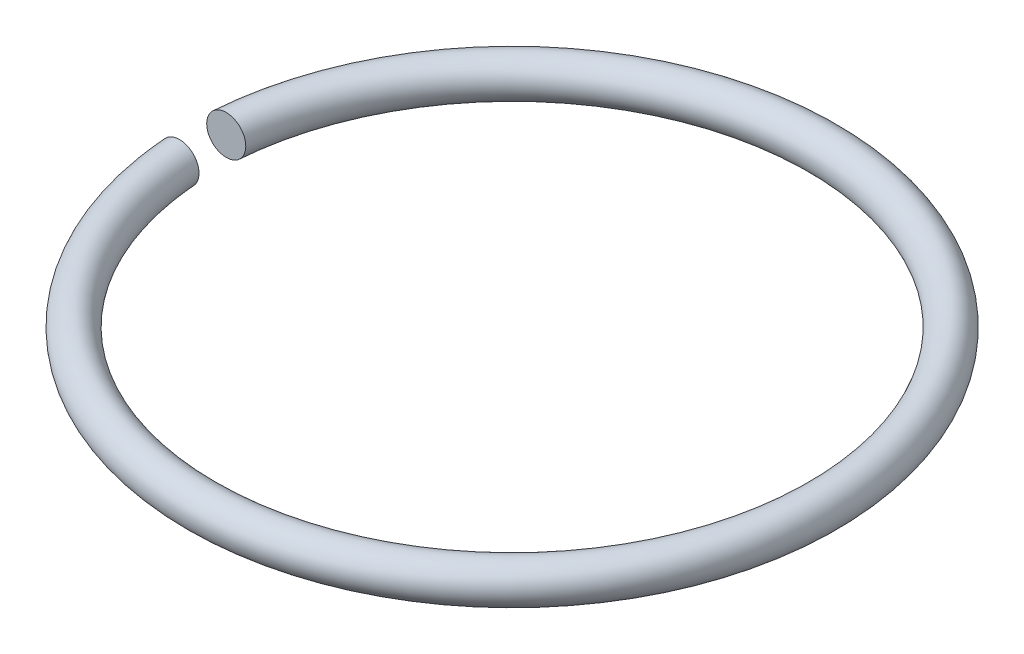
ISO-10303-21;
HEADER;
FILE_DESCRIPTION(('STEP AP214'),'2;1');
FILE_NAME('part.step','',(''),(''),'','','');
FILE_SCHEMA(('AUTOMOTIVE_DESIGN { 1 0 10303 214 1 1 1 1 }'));
ENDSEC;
DATA;
#1=APPLICATION_CONTEXT('core data for automotive mechanical design processes');
#2=APPLICATION_PROTOCOL_DEFINITION('international standard','automotive_design',2000,#1);
#3=PRODUCT_CONTEXT('',#1,'mechanical');
#4=PRODUCT('Part','Part','',(#3));
#5=PRODUCT_RELATED_PRODUCT_CATEGORY('part','',(#4));
#6=PRODUCT_DEFINITION_FORMATION('','',#4);
#7=PRODUCT_DEFINITION_CONTEXT('part definition',#1,'design');
#8=PRODUCT_DEFINITION('design','',#6,#7);
#9=PRODUCT_DEFINITION_SHAPE('','',#8);
#10=(LENGTH_UNIT() NAMED_UNIT(*) SI_UNIT(.MILLI.,.METRE.));
#11=(NAMED_UNIT(*) PLANE_ANGLE_UNIT() SI_UNIT($,.RADIAN.));
#12=(NAMED_UNIT(*) SI_UNIT($,.STERADIAN.) SOLID_ANGLE_UNIT());
#13=UNCERTAINTY_MEASURE_WITH_UNIT(LENGTH_MEASURE(1.E-05),#10,'distance_accuracy_value','');
#14=(GEOMETRIC_REPRESENTATION_CONTEXT(3) GLOBAL_UNCERTAINTY_ASSIGNED_CONTEXT((#13)) GLOBAL_UNIT_ASSIGNED_CONTEXT((#10,
#11,#12)) REPRESENTATION_CONTEXT('',''));
#15=CARTESIAN_POINT('',(0.,0.,0.));
#16=DIRECTION('',(0.,0.,1.));
#17=DIRECTION('',(1.,0.,0.));
#18=AXIS2_PLACEMENT_3D('',#15,#16,#17);
#19=CARTESIAN_POINT('',(0.,1.25,0.));
#20=DIRECTION('',(0.,-1.,0.));
#21=DIRECTION('',(0.,0.,-1.));
#22=AXIS2_PLACEMENT_3D('',#19,#20,#21);
#23=TOROIDAL_SURFACE('',#22,19.9,1.25);
#24=CARTESIAN_POINT('',(-20.9021824286294,0.581045337264175,1.5));
#25=CARTESIAN_POINT('',(-20.9397594164405,0.64021369669579,1.5));
#26=CARTESIAN_POINT('',(-20.9723730883378,0.702593877343459,1.5));
#27=CARTESIAN_POINT('',(-21.0266929579685,0.83199518138793,1.5));
#28=CARTESIAN_POINT('',(-21.0483862666287,0.899021683128394,1.5));
#29=CARTESIAN_POINT('',(-21.0801970165623,1.03574473228337,1.5));
#30=CARTESIAN_POINT('',(-21.0903193137983,1.10544014694468,1.5));
#31=CARTESIAN_POINT('',(-21.098705969198,1.24552217488984,1.5));
#32=CARTESIAN_POINT('',(-21.0969732316156,1.31590861466699,1.5));
#33=CARTESIAN_POINT('',(-21.0817130853729,1.45534543817069,1.5));
#34=CARTESIAN_POINT('',(-21.0681932425124,1.52439664988545,1.5));
#35=CARTESIAN_POINT('',(-21.0297570581194,1.65925313853571,1.5));
#36=CARTESIAN_POINT('',(-21.0048402845461,1.72505829231315,1.5));
#37=CARTESIAN_POINT('',(-20.9443124075155,1.85158543371897,1.5));
#38=CARTESIAN_POINT('',(-20.9086967253803,1.91230523077518,1.5));
#39=CARTESIAN_POINT('',(-20.8277944484595,2.02691766282978,1.5));
#40=CARTESIAN_POINT('',(-20.7825077958206,2.08081025698363,1.5));
#41=CARTESIAN_POINT('',(-20.683463592008,2.18034656039134,1.5));
#42=CARTESIAN_POINT('',(-20.6296907346404,2.22597503833715,1.5));
#43=CARTESIAN_POINT('',(-20.5152644444986,2.30758381562887,1.5));
#44=CARTESIAN_POINT('',(-20.4546109328256,2.34356400432405,1.5));
#45=CARTESIAN_POINT('',(-20.3279802786927,2.40495198597518,1.5));
#46=CARTESIAN_POINT('',(-20.2619900082445,2.43033269875267,1.5));
#47=CARTESIAN_POINT('',(-20.1266906767469,2.4696834053442,1.5));
#48=CARTESIAN_POINT('',(-20.0573815667743,2.48365323089507,1.5));
#49=CARTESIAN_POINT('',(-19.9172436830225,2.49981387500441,1.5));
#50=CARTESIAN_POINT('',(-19.846411817822,2.50197789377334,1.5));
#51=CARTESIAN_POINT('',(-19.7053880176522,2.49439666511234,1.5));
#52=CARTESIAN_POINT('',(-19.6351960877967,2.48465132259611,1.5));
#53=CARTESIAN_POINT('',(-19.4973717493736,2.45350897244964,1.5));
#54=CARTESIAN_POINT('',(-19.4297419781786,2.43210028990307,1.5));
#55=CARTESIAN_POINT('',(-19.2990407091183,2.37822348507742,1.5));
#56=CARTESIAN_POINT('',(-19.2359692048754,2.34575537827228,1.5));
#57=CARTESIAN_POINT('',(-19.1162369273039,2.27070372710002,1.5));
#58=CARTESIAN_POINT('',(-19.0595707572796,2.22812879325033,1.5));
#59=CARTESIAN_POINT('',(-18.9542127971554,2.1340479819347,1.5));
#60=CARTESIAN_POINT('',(-18.9055209108995,2.0825422121745,1.5));
#61=CARTESIAN_POINT('',(-18.8176263149927,1.97219649971104,1.5));
#62=CARTESIAN_POINT('',(-18.7784002930856,1.9133751270297,1.5));
#63=CARTESIAN_POINT('',(-18.7104155821029,1.78996585248112,1.5));
#64=CARTESIAN_POINT('',(-18.6816567108371,1.72537805100814,1.5));
#65=CARTESIAN_POINT('',(-18.6355128650433,1.59248064127119,1.5));
#66=CARTESIAN_POINT('',(-18.6180935182358,1.52418296675916,1.5));
#67=CARTESIAN_POINT('',(-18.5949952883395,1.38563057635821,1.5));
#68=CARTESIAN_POINT('',(-18.5893162380524,1.31537588835433,1.5));
#69=CARTESIAN_POINT('',(-18.589862937401,1.17506102715304,1.5));
#70=CARTESIAN_POINT('',(-18.5960637177958,1.10500075524868,1.5));
#71=CARTESIAN_POINT('',(-18.6201406517279,0.966916430415538,1.5));
#72=CARTESIAN_POINT('',(-18.6380167698682,0.898892371314059,1.5));
#73=CARTESIAN_POINT('',(-18.6849259999563,0.766811768264875,1.5));
#74=CARTESIAN_POINT('',(-18.7139584752441,0.702754998157976,1.5));
#75=CARTESIAN_POINT('',(-18.7823447600348,0.580411420918562,1.5));
#76=CARTESIAN_POINT('',(-18.8216986483044,0.52212465782385,1.5));
#77=CARTESIAN_POINT('',(-18.9096905426526,0.412846643992155,1.5));
#78=CARTESIAN_POINT('',(-18.9583470379339,0.361870282091835,1.5));
#79=CARTESIAN_POINT('',(-19.0635048003008,0.268779460010768,1.5));
#80=CARTESIAN_POINT('',(-19.1200062067797,0.226665157330189,1.5));
#81=CARTESIAN_POINT('',(-19.2394329165993,0.152359222430462,1.5));
#82=CARTESIAN_POINT('',(-19.3023771246544,0.120197974007663,1.5));
#83=CARTESIAN_POINT('',(-19.4327619545977,0.0668682285838888,1.5));
#84=CARTESIAN_POINT('',(-19.5002026540771,0.0456999213319628,1.5));
#85=CARTESIAN_POINT('',(-19.6378527039278,0.0149061258486271,1.5));
#86=CARTESIAN_POINT('',(-19.7080687378549,0.00531050773133249,1.5));
#87=CARTESIAN_POINT('',(-19.8491132092786,-0.00196861976453549,1.5));
#88=CARTESIAN_POINT('',(-19.9199416276316,0.000347499822883562,1.5));
#89=CARTESIAN_POINT('',(-20.060267396559,0.0168352875382059,1.5));
#90=CARTESIAN_POINT('',(-20.1297635390206,0.0310172394998929,1.5));
#91=CARTESIAN_POINT('',(-20.2654035404557,0.0708626294050575,1.5));
#92=CARTESIAN_POINT('',(-20.3315465714377,0.0965288879683932,1.5));
#93=CARTESIAN_POINT('',(-20.4585420190372,0.158604447803147,1.5));
#94=CARTESIAN_POINT('',(-20.5193966164021,0.195009293417483,1.5));
#95=CARTESIAN_POINT('',(-20.6340547471689,0.277518072583835,1.5));
#96=CARTESIAN_POINT('',(-20.6878667457395,0.323610185071169,1.5));
#97=CARTESIAN_POINT('',(-20.7684188314266,0.405359549910401,1.5));
#98=CARTESIAN_POINT('',(-20.7977668941346,0.438490692574881,1.5));
#99=CARTESIAN_POINT('',(-20.8527958756752,0.507670259410195,1.5));
#100=CARTESIAN_POINT('',(-20.8784767975369,0.543718681171304,1.5));
#101=CARTESIAN_POINT('',(-20.9021824286294,0.581045337264175,1.5));
#102=B_SPLINE_CURVE_WITH_KNOTS('',3,(#24,#25,#26,#27,#28,#29,#30,#31,#32,#33,#34,#35,#36,#37,
#38,#39,#40,#41,#42,#43,#44,#45,#46,#47,#48,#49,#50,#51,#52,#53,#54,#55,#56,#57,#58,#59,#60,#61,
#62,#63,#64,#65,#66,#67,#68,#69,#70,#71,#72,#73,#74,#75,#76,#77,#78,#79,#80,#81,#82,#83,#84,#85,
#86,#87,#88,#89,#90,#91,#92,#93,#94,#95,#96,#97,#98,#99,#100,#101),.UNSPECIFIED.,.T.,.F.,(4,2,2,
2,2,2,2,2,2,2,2,2,2,2,2,2,2,2,2,2,2,2,2,2,2,2,2,2,2,2,2,2,2,2,2,2,2,2,4),(0.,0.210115702752041,
0.420478822545599,0.630753627594198,0.840976921233376,1.0510653779217,1.26116179941461,
1.47134826164712,1.68153598128519,1.89210723370946,2.10268090095202,2.31378931103718,
2.52490083403796,2.73649139227643,2.94808363989992,3.15988807998841,3.37169222372893,
3.58331656432944,3.79493835292118,4.00603352135374,4.21712501530913,4.42757363355913,
4.6380192547065,4.84802304268498,5.05802619398146,5.26801736280276,5.47801013419346,
5.68842469466946,5.89884299440396,6.10989744449759,6.32095553747892,6.53255723177367,
6.74415233501084,6.95593101286203,7.16776173349924,7.37950468461987,7.59099073732436,
7.72354339097241,7.85609593513077),.UNSPECIFIED.);
#103=CARTESIAN_POINT('',(-20.9021824286294,0.581045337264175,1.5));
#104=VERTEX_POINT('',#103);
#105=EDGE_CURVE('E10',#104,#104,#102,.T.);
#106=ORIENTED_EDGE('',*,*,#105,.F.);
#107=EDGE_LOOP('',(#106));
#108=FACE_BOUND('',#107,.T.);
#109=CARTESIAN_POINT('',(-20.9021824286294,0.581045337264175,-1.5));
#110=CARTESIAN_POINT('',(-20.8644789175081,0.521689441041707,-1.5));
#111=CARTESIAN_POINT('',(-20.8217250920078,0.465479924742291,-1.5));
#112=CARTESIAN_POINT('',(-20.7273444700609,0.360996772984402,-1.5));
#113=CARTESIAN_POINT('',(-20.6757068085759,0.312732998402325,-1.5));
#114=CARTESIAN_POINT('',(-20.5650907444762,0.225579830177048,-1.5));
#115=CARTESIAN_POINT('',(-20.5061166745679,0.186684942976447,-1.5));
#116=CARTESIAN_POINT('',(-20.3825020286344,0.119338012311962,-1.5));
#117=CARTESIAN_POINT('',(-20.3178628578398,0.0908833881679522,-1.5));
#118=CARTESIAN_POINT('',(-20.1846026505594,0.0451472035800535,-1.5));
#119=CARTESIAN_POINT('',(-20.1159740097333,0.0278877975755041,-1.5));
#120=CARTESIAN_POINT('',(-19.9767922861004,0.00511057615501577,-1.5));
#121=CARTESIAN_POINT('',(-19.9062391034394,-0.00040662884325618,-1.5));
#122=CARTESIAN_POINT('',(-19.765070810388,0.000454179186687773,-1.5));
#123=CARTESIAN_POINT('',(-19.6944558369726,0.00685480962623194,-1.5));
#124=CARTESIAN_POINT('',(-19.5553011068218,0.0314154027006498,-1.5));
#125=CARTESIAN_POINT('',(-19.4867613569259,0.0495754040879692,-1.5));
#126=CARTESIAN_POINT('',(-19.3536787722419,0.0971550696080564,-1.5));
#127=CARTESIAN_POINT('',(-19.2891374346209,0.126578922127856,-1.5));
#128=CARTESIAN_POINT('',(-19.1659207912967,0.195860181326104,-1.5));
#129=CARTESIAN_POINT('',(-19.1072454422535,0.235717510910293,-1.5));
#130=CARTESIAN_POINT('',(-18.9975257794014,0.324675575947887,-1.5));
#131=CARTESIAN_POINT('',(-18.9464700763799,0.373762262809899,-1.5));
#132=CARTESIAN_POINT('',(-18.8533529341917,0.479832177771311,-1.5));
#133=CARTESIAN_POINT('',(-18.8112913714556,0.53681529736479,-1.5));
#134=CARTESIAN_POINT('',(-18.7374858472545,0.656887525454583,-1.5));
#135=CARTESIAN_POINT('',(-18.7057128184404,0.719958766592811,-1.5));
#136=CARTESIAN_POINT('',(-18.6532416129825,0.850551061297314,-1.5));
#137=CARTESIAN_POINT('',(-18.6325432400258,0.918072035962277,-1.5));
#138=CARTESIAN_POINT('',(-18.6028664744928,1.05543845973981,-1.5));
#139=CARTESIAN_POINT('',(-18.5938545412015,1.12527666394347,-1.5));
#140=CARTESIAN_POINT('',(-18.5877022869998,1.26547371220728,-1.5));
#141=CARTESIAN_POINT('',(-18.5905618385413,1.33583255066561,-1.5));
#142=CARTESIAN_POINT('',(-18.6080564425391,1.47496659527501,-1.5));
#143=CARTESIAN_POINT('',(-18.6226744661346,1.54374394371779,-1.5));
#144=CARTESIAN_POINT('',(-18.6632414886675,1.67787102266535,-1.5));
#145=CARTESIAN_POINT('',(-18.6891904997068,1.74322074950926,-1.5));
#146=CARTESIAN_POINT('',(-18.7516952108516,1.86869405371574,-1.5));
#147=CARTESIAN_POINT('',(-18.7882588023104,1.92881369942602,-1.5));
#148=CARTESIAN_POINT('',(-18.8709361803237,2.04208148356062,-1.5));
#149=CARTESIAN_POINT('',(-18.9170500829291,2.09522953725675,-1.5));
#150=CARTESIAN_POINT('',(-19.0176415916834,2.19319188570168,-1.5));
#151=CARTESIAN_POINT('',(-19.072140105006,2.23798471121797,-1.5));
#152=CARTESIAN_POINT('',(-19.1878645747832,2.31781809172641,-1.5));
#153=CARTESIAN_POINT('',(-19.2490906424726,2.35285848543586,-1.5));
#154=CARTESIAN_POINT('',(-19.3767314391684,2.41230197603584,-1.5));
#155=CARTESIAN_POINT('',(-19.4431612989983,2.43667258486542,-1.5));
#156=CARTESIAN_POINT('',(-19.5791649247021,2.47394155510761,-1.5));
#157=CARTESIAN_POINT('',(-19.648738733503,2.48683975982768,-1.5));
#158=CARTESIAN_POINT('',(-19.7892102282156,2.50081783174143,-1.5));
#159=CARTESIAN_POINT('',(-19.8601103649706,2.50187308184115,-1.5));
#160=CARTESIAN_POINT('',(-20.0010824158151,2.49206959008613,-1.5));
#161=CARTESIAN_POINT('',(-20.0711543272472,2.48121081001518,-1.5));
#162=CARTESIAN_POINT('',(-20.2084999559915,2.4478755270586,-1.5));
#163=CARTESIAN_POINT('',(-20.2757728632433,2.42539568584335,-1.5));
#164=CARTESIAN_POINT('',(-20.405581749427,2.36944466935048,-1.5));
#165=CARTESIAN_POINT('',(-20.4681177467283,2.33597353669904,-1.5));
#166=CARTESIAN_POINT('',(-20.5865763386988,2.25903788941229,-1.5));
#167=CARTESIAN_POINT('',(-20.6425084879054,2.21558808710488,-1.5));
#168=CARTESIAN_POINT('',(-20.7462616971583,2.11989363280385,-1.5));
#169=CARTESIAN_POINT('',(-20.7940828426718,2.06764907349399,-1.5));
#170=CARTESIAN_POINT('',(-20.8801308973472,1.95598454066383,-1.5));
#171=CARTESIAN_POINT('',(-20.918380985474,1.89658242885452,-1.5));
#172=CARTESIAN_POINT('',(-20.9843356226567,1.77218974925765,-1.5));
#173=CARTESIAN_POINT('',(-21.0120407335832,1.70719947945166,-1.5));
#174=CARTESIAN_POINT('',(-21.056051527056,1.57365027302448,-1.5));
#175=CARTESIAN_POINT('',(-21.0723858284055,1.50510076575372,-1.5));
#176=CARTESIAN_POINT('',(-21.0932985766811,1.36621233767611,-1.5));
#177=CARTESIAN_POINT('',(-21.0978742017074,1.29587299142511,-1.5));
#178=CARTESIAN_POINT('',(-21.0951345904716,1.15550199917397,-1.5));
#179=CARTESIAN_POINT('',(-21.0878309406448,1.08547012007269,-1.5));
#180=CARTESIAN_POINT('',(-21.0615658675923,0.947688285381492,-1.5));
#181=CARTESIAN_POINT('',(-21.0426185748155,0.879935668692057,-1.5));
#182=CARTESIAN_POINT('',(-21.0029526565684,0.773529997212173,-1.5));
#183=CARTESIAN_POINT('',(-20.9856258076137,0.733578652823499,-1.5));
#184=CARTESIAN_POINT('',(-20.9469045460627,0.655698499736981,-1.5));
#185=CARTESIAN_POINT('',(-20.9255101367129,0.617769689424872,-1.5));
#186=CARTESIAN_POINT('',(-20.9021824286294,0.581045337264175,-1.5));
#187=B_SPLINE_CURVE_WITH_KNOTS('',3,(#109,#110,#111,#112,#113,#114,#115,#116,#117,#118,#119,
#120,#121,#122,#123,#124,#125,#126,#127,#128,#129,#130,#131,#132,#133,#134,#135,#136,#137,#138,
#139,#140,#141,#142,#143,#144,#145,#146,#147,#148,#149,#150,#151,#152,#153,#154,#155,#156,#157,
#158,#159,#160,#161,#162,#163,#164,#165,#166,#167,#168,#169,#170,#171,#172,#173,#174,#175,#176,
#177,#178,#179,#180,#181,#182,#183,#184,#185,#186),.UNSPECIFIED.,.T.,.F.,(4,2,2,2,2,2,2,2,2,2,2,
2,2,2,2,2,2,2,2,2,2,2,2,2,2,2,2,2,2,2,2,2,2,2,2,2,2,2,4),(0.,0.21079587629664,0.421851415389795,
0.632782896674821,0.843662203604774,1.05495756080444,1.26626390191325,1.47797166442368,
1.68968012461049,1.90146738374631,2.1132530780039,2.32471897202196,2.53618196054742,
2.7470421991794,2.95789869990774,3.16814868181484,3.37839640478825,3.58834018971284,
3.79828419886377,4.00838469123938,4.21848773680319,4.42912343296079,4.63976261233977,
4.85103877325286,5.06231781977631,5.2740359556447,5.48575477063573,5.69753443895658,
5.90931328596764,6.12078187304925,6.33224823170324,6.5431973984806,6.75413532362432,
6.96454040786737,7.17499598134884,7.38524641032234,7.59524218687117,7.72566475087218,
7.85608721077617),.UNSPECIFIED.);
#188=CARTESIAN_POINT('',(-20.9021824286294,0.581045337264175,-1.5));
#189=VERTEX_POINT('',#188);
#190=EDGE_CURVE('E42',#189,#189,#187,.T.);
#191=ORIENTED_EDGE('',*,*,#190,.F.);
#192=EDGE_LOOP('',(#191));
#193=FACE_BOUND('',#192,.T.);
#194=ADVANCED_FACE('F32',(#108,#193),#23,.T.);
#195=CARTESIAN_POINT('',(-24.8397984938212,2.5,-1.5));
#196=DIRECTION('',(0.,0.,1.));
#197=DIRECTION('',(1.,0.,0.));
#198=AXIS2_PLACEMENT_3D('',#195,#196,#197);
#199=PLANE('',#198);
#200=ORIENTED_EDGE('',*,*,#190,.T.);
#201=EDGE_LOOP('',(#200));
#202=FACE_BOUND('',#201,.T.);
#203=ADVANCED_FACE('F52',(#202),#199,.T.);
#204=CARTESIAN_POINT('',(-24.8397984938212,2.5,1.5));
#205=DIRECTION('',(0.,0.,-1.));
#206=DIRECTION('',(-1.,0.,0.));
#207=AXIS2_PLACEMENT_3D('',#204,#205,#206);
#208=PLANE('',#207);
#209=ORIENTED_EDGE('',*,*,#105,.T.);
#210=EDGE_LOOP('',(#209));
#211=FACE_BOUND('',#210,.T.);
#212=ADVANCED_FACE('F55',(#211),#208,.T.);
#213=CLOSED_SHELL('',(#194,#203,#212));
#214=MANIFOLD_SOLID_BREP('B2',#213);
#215=ADVANCED_BREP_SHAPE_REPRESENTATION('',(#18,#214),#14);
#216=SHAPE_DEFINITION_REPRESENTATION(#9,#215);
ENDSEC;
END-ISO-10303-21;
